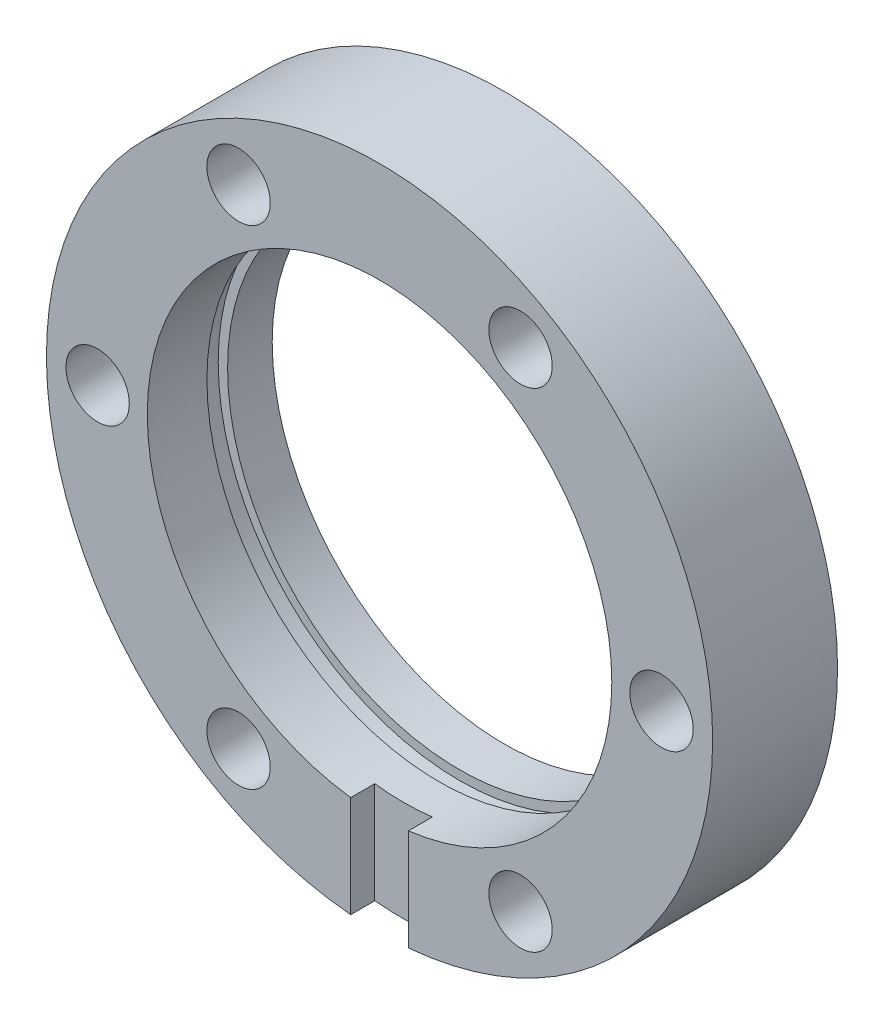
ISO-10303-21;
HEADER;
FILE_DESCRIPTION(('STEP AP214'),'2;1');
FILE_NAME('part.step','',(''),(''),'','','');
FILE_SCHEMA(('AUTOMOTIVE_DESIGN { 1 0 10303 214 1 1 1 1 }'));
ENDSEC;
DATA;
#1=APPLICATION_CONTEXT('core data for automotive mechanical design processes');
#2=APPLICATION_PROTOCOL_DEFINITION('international standard','automotive_design',2000,#1);
#3=PRODUCT_CONTEXT('',#1,'mechanical');
#4=PRODUCT('Part','Part','',(#3));
#5=PRODUCT_RELATED_PRODUCT_CATEGORY('part','',(#4));
#6=PRODUCT_DEFINITION_FORMATION('','',#4);
#7=PRODUCT_DEFINITION_CONTEXT('part definition',#1,'design');
#8=PRODUCT_DEFINITION('design','',#6,#7);
#9=PRODUCT_DEFINITION_SHAPE('','',#8);
#10=(LENGTH_UNIT() NAMED_UNIT(*) SI_UNIT(.MILLI.,.METRE.));
#11=(NAMED_UNIT(*) PLANE_ANGLE_UNIT() SI_UNIT($,.RADIAN.));
#12=(NAMED_UNIT(*) SI_UNIT($,.STERADIAN.) SOLID_ANGLE_UNIT());
#13=UNCERTAINTY_MEASURE_WITH_UNIT(LENGTH_MEASURE(1.E-05),#10,'distance_accuracy_value','');
#14=(GEOMETRIC_REPRESENTATION_CONTEXT(3) GLOBAL_UNCERTAINTY_ASSIGNED_CONTEXT((#13)) GLOBAL_UNIT_ASSIGNED_CONTEXT((#10,
#11,#12)) REPRESENTATION_CONTEXT('',''));
#15=CARTESIAN_POINT('',(0.,0.,0.));
#16=DIRECTION('',(0.,0.,1.));
#17=DIRECTION('',(1.,0.,0.));
#18=AXIS2_PLACEMENT_3D('',#15,#16,#17);
#19=CARTESIAN_POINT('',(14.675,-25.4178456010733,-13.));
#20=DIRECTION('',(0.,0.,-1.));
#21=DIRECTION('',(-0.5,0.866025403784439,0.));
#22=AXIS2_PLACEMENT_3D('',#19,#20,#21);
#23=CYLINDRICAL_SURFACE('',#22,3.3);
#24=CARTESIAN_POINT('',(14.675,-25.4178456010733,-13.));
#25=DIRECTION('',(0.,0.,-1.));
#26=DIRECTION('',(-0.5,0.866025403784439,0.));
#27=AXIS2_PLACEMENT_3D('',#24,#25,#26);
#28=CIRCLE('',#27,3.3);
#29=CARTESIAN_POINT('',(13.025,-22.5599617685846,-13.));
#30=VERTEX_POINT('',#29);
#31=EDGE_CURVE('E156',#30,#30,#28,.T.);
#32=ORIENTED_EDGE('',*,*,#31,.T.);
#33=EDGE_LOOP('',(#32));
#34=FACE_BOUND('',#33,.T.);
#35=CARTESIAN_POINT('',(14.675,-25.4178456010733,0.));
#36=DIRECTION('',(0.,0.,-1.));
#37=DIRECTION('',(-0.5,0.866025403784439,0.));
#38=AXIS2_PLACEMENT_3D('',#35,#36,#37);
#39=CIRCLE('',#38,3.3);
#40=CARTESIAN_POINT('',(13.025,-22.5599617685846,0.));
#41=VERTEX_POINT('',#40);
#42=EDGE_CURVE('E194',#41,#41,#39,.T.);
#43=ORIENTED_EDGE('',*,*,#42,.F.);
#44=EDGE_LOOP('',(#43));
#45=FACE_BOUND('',#44,.T.);
#46=ADVANCED_FACE('F16',(#34,#45),#23,.F.);
#47=CARTESIAN_POINT('',(-14.675,-25.4178456010733,-13.));
#48=DIRECTION('',(0.,0.,-1.));
#49=DIRECTION('',(0.5,0.866025403784439,0.));
#50=AXIS2_PLACEMENT_3D('',#47,#48,#49);
#51=CYLINDRICAL_SURFACE('',#50,3.3);
#52=CARTESIAN_POINT('',(-14.675,-25.4178456010733,-13.));
#53=DIRECTION('',(0.,0.,-1.));
#54=DIRECTION('',(0.5,0.866025403784438,0.));
#55=AXIS2_PLACEMENT_3D('',#52,#53,#54);
#56=CIRCLE('',#55,3.3);
#57=CARTESIAN_POINT('',(-13.025,-22.5599617685846,-13.));
#58=VERTEX_POINT('',#57);
#59=EDGE_CURVE('E160',#58,#58,#56,.T.);
#60=ORIENTED_EDGE('',*,*,#59,.T.);
#61=EDGE_LOOP('',(#60));
#62=FACE_BOUND('',#61,.T.);
#63=CARTESIAN_POINT('',(-14.675,-25.4178456010733,0.));
#64=DIRECTION('',(0.,0.,-1.));
#65=DIRECTION('',(0.5,0.866025403784439,0.));
#66=AXIS2_PLACEMENT_3D('',#63,#64,#65);
#67=CIRCLE('',#66,3.3);
#68=CARTESIAN_POINT('',(-13.025,-22.5599617685846,0.));
#69=VERTEX_POINT('',#68);
#70=EDGE_CURVE('E200',#69,#69,#67,.T.);
#71=ORIENTED_EDGE('',*,*,#70,.F.);
#72=EDGE_LOOP('',(#71));
#73=FACE_BOUND('',#72,.T.);
#74=ADVANCED_FACE('F190',(#62,#73),#51,.F.);
#75=CARTESIAN_POINT('',(-29.35,0.,-13.));
#76=DIRECTION('',(0.,0.,-1.));
#77=DIRECTION('',(1.,0.,0.));
#78=AXIS2_PLACEMENT_3D('',#75,#76,#77);
#79=CYLINDRICAL_SURFACE('',#78,3.3);
#80=CARTESIAN_POINT('',(-29.35,0.,-13.));
#81=DIRECTION('',(0.,0.,-1.));
#82=DIRECTION('',(1.,0.,0.));
#83=AXIS2_PLACEMENT_3D('',#80,#81,#82);
#84=CIRCLE('',#83,3.3);
#85=CARTESIAN_POINT('',(-26.05,0.,-13.));
#86=VERTEX_POINT('',#85);
#87=EDGE_CURVE('E163',#86,#86,#84,.T.);
#88=ORIENTED_EDGE('',*,*,#87,.T.);
#89=EDGE_LOOP('',(#88));
#90=FACE_BOUND('',#89,.T.);
#91=CARTESIAN_POINT('',(-29.35,0.,0.));
#92=DIRECTION('',(0.,0.,-1.));
#93=DIRECTION('',(1.,0.,0.));
#94=AXIS2_PLACEMENT_3D('',#91,#92,#93);
#95=CIRCLE('',#94,3.3);
#96=CARTESIAN_POINT('',(-26.05,0.,0.));
#97=VERTEX_POINT('',#96);
#98=EDGE_CURVE('E207',#97,#97,#95,.T.);
#99=ORIENTED_EDGE('',*,*,#98,.F.);
#100=EDGE_LOOP('',(#99));
#101=FACE_BOUND('',#100,.T.);
#102=ADVANCED_FACE('F311',(#90,#101),#79,.F.);
#103=CARTESIAN_POINT('',(-14.675,25.4178456010733,-13.));
#104=DIRECTION('',(0.,0.,-1.));
#105=DIRECTION('',(0.5,-0.866025403784439,0.));
#106=AXIS2_PLACEMENT_3D('',#103,#104,#105);
#107=CYLINDRICAL_SURFACE('',#106,3.3);
#108=CARTESIAN_POINT('',(-14.675,25.4178456010733,-13.));
#109=DIRECTION('',(0.,0.,-1.));
#110=DIRECTION('',(0.5,-0.866025403784439,0.));
#111=AXIS2_PLACEMENT_3D('',#108,#109,#110);
#112=CIRCLE('',#111,3.3);
#113=CARTESIAN_POINT('',(-13.025,22.5599617685846,-13.));
#114=VERTEX_POINT('',#113);
#115=EDGE_CURVE('E166',#114,#114,#112,.T.);
#116=ORIENTED_EDGE('',*,*,#115,.T.);
#117=EDGE_LOOP('',(#116));
#118=FACE_BOUND('',#117,.T.);
#119=CARTESIAN_POINT('',(-14.675,25.4178456010733,0.));
#120=DIRECTION('',(0.,0.,-1.));
#121=DIRECTION('',(0.5,-0.866025403784439,0.));
#122=AXIS2_PLACEMENT_3D('',#119,#120,#121);
#123=CIRCLE('',#122,3.3);
#124=CARTESIAN_POINT('',(-13.025,22.5599617685846,0.));
#125=VERTEX_POINT('',#124);
#126=EDGE_CURVE('E220',#125,#125,#123,.T.);
#127=ORIENTED_EDGE('',*,*,#126,.F.);
#128=EDGE_LOOP('',(#127));
#129=FACE_BOUND('',#128,.T.);
#130=ADVANCED_FACE('F296',(#118,#129),#107,.F.);
#131=CARTESIAN_POINT('',(14.675,25.4178456010733,-13.));
#132=DIRECTION('',(0.,0.,-1.));
#133=DIRECTION('',(-0.5,-0.866025403784439,0.));
#134=AXIS2_PLACEMENT_3D('',#131,#132,#133);
#135=CYLINDRICAL_SURFACE('',#134,3.3);
#136=CARTESIAN_POINT('',(14.675,25.4178456010733,-13.));
#137=DIRECTION('',(0.,0.,-1.));
#138=DIRECTION('',(-0.5,-0.866025403784439,0.));
#139=AXIS2_PLACEMENT_3D('',#136,#137,#138);
#140=CIRCLE('',#139,3.3);
#141=CARTESIAN_POINT('',(13.025,22.5599617685846,-13.));
#142=VERTEX_POINT('',#141);
#143=EDGE_CURVE('E103',#142,#142,#140,.T.);
#144=ORIENTED_EDGE('',*,*,#143,.T.);
#145=EDGE_LOOP('',(#144));
#146=FACE_BOUND('',#145,.T.);
#147=CARTESIAN_POINT('',(14.675,25.4178456010733,0.));
#148=DIRECTION('',(0.,0.,-1.));
#149=DIRECTION('',(-0.5,-0.866025403784439,0.));
#150=AXIS2_PLACEMENT_3D('',#147,#148,#149);
#151=CIRCLE('',#150,3.3);
#152=CARTESIAN_POINT('',(13.025,22.5599617685846,0.));
#153=VERTEX_POINT('',#152);
#154=EDGE_CURVE('E211',#153,#153,#151,.T.);
#155=ORIENTED_EDGE('',*,*,#154,.F.);
#156=EDGE_LOOP('',(#155));
#157=FACE_BOUND('',#156,.T.);
#158=ADVANCED_FACE('F172',(#146,#157),#135,.F.);
#159=CARTESIAN_POINT('',(-3.,-38.1425,0.));
#160=DIRECTION('',(1.,0.,0.));
#161=DIRECTION('',(0.,1.,0.));
#162=AXIS2_PLACEMENT_3D('',#159,#160,#161);
#163=PLANE('',#162);
#164=DIRECTION('',(0.,1.,0.));
#165=VECTOR('',#164,1.);
#166=CARTESIAN_POINT('',(-3.,-38.1425,0.));
#167=LINE('',#166,#165);
#168=CARTESIAN_POINT('',(-3.,-34.5449797365695,0.));
#169=VERTEX_POINT('',#168);
#170=CARTESIAN_POINT('',(-3.,-23.9881350879971,0.));
#171=VERTEX_POINT('',#170);
#172=EDGE_CURVE('E212',#169,#171,#167,.T.);
#173=ORIENTED_EDGE('',*,*,#172,.F.);
#174=DIRECTION('',(0.,0.,-1.));
#175=VECTOR('',#174,1.);
#176=CARTESIAN_POINT('',(-3.,-34.5449797365695,0.));
#177=LINE('',#176,#175);
#178=CARTESIAN_POINT('',(-3.,-34.5449797365695,-2.5));
#179=VERTEX_POINT('',#178);
#180=EDGE_CURVE('E150',#169,#179,#177,.T.);
#181=ORIENTED_EDGE('',*,*,#180,.T.);
#182=DIRECTION('',(0.,1.,0.));
#183=VECTOR('',#182,1.);
#184=CARTESIAN_POINT('',(-3.,-38.1425,-2.5));
#185=LINE('',#184,#183);
#186=CARTESIAN_POINT('',(-3.,-23.9881350879971,-2.5));
#187=VERTEX_POINT('',#186);
#188=EDGE_CURVE('E11',#179,#187,#185,.T.);
#189=ORIENTED_EDGE('',*,*,#188,.T.);
#190=DIRECTION('',(0.,0.,-1.));
#191=VECTOR('',#190,1.);
#192=CARTESIAN_POINT('',(-3.,-23.9881350879971,0.));
#193=LINE('',#192,#191);
#194=EDGE_CURVE('E137',#171,#187,#193,.T.);
#195=ORIENTED_EDGE('',*,*,#194,.F.);
#196=EDGE_LOOP('',(#173,#181,#189,#195));
#197=FACE_BOUND('',#196,.T.);
#198=ADVANCED_FACE('F248',(#197),#163,.T.);
#199=CARTESIAN_POINT('',(-3.,-38.1425,-2.5));
#200=DIRECTION('',(0.,0.,1.));
#201=DIRECTION('',(1.,0.,0.));
#202=AXIS2_PLACEMENT_3D('',#199,#200,#201);
#203=PLANE('',#202);
#204=ORIENTED_EDGE('',*,*,#188,.F.);
#205=CARTESIAN_POINT('',(0.,0.,-2.5));
#206=DIRECTION('',(0.,0.,1.));
#207=DIRECTION('',(1.,0.,0.));
#208=AXIS2_PLACEMENT_3D('',#205,#206,#207);
#209=CIRCLE('',#208,34.675);
#210=CARTESIAN_POINT('',(3.,-34.5449797365695,-2.5));
#211=VERTEX_POINT('',#210);
#212=EDGE_CURVE('E122',#179,#211,#209,.T.);
#213=ORIENTED_EDGE('',*,*,#212,.T.);
#214=DIRECTION('',(0.,1.,0.));
#215=VECTOR('',#214,1.);
#216=CARTESIAN_POINT('',(3.,-38.1425,-2.5));
#217=LINE('',#216,#215);
#218=CARTESIAN_POINT('',(3.,-23.9881350879971,-2.5));
#219=VERTEX_POINT('',#218);
#220=EDGE_CURVE('E19',#211,#219,#217,.T.);
#221=ORIENTED_EDGE('',*,*,#220,.T.);
#222=CARTESIAN_POINT('',(0.,0.,-2.5));
#223=DIRECTION('',(0.,0.,1.));
#224=DIRECTION('',(1.,0.,0.));
#225=AXIS2_PLACEMENT_3D('',#222,#223,#224);
#226=CIRCLE('',#225,24.175);
#227=EDGE_CURVE('E120',#187,#219,#226,.T.);
#228=ORIENTED_EDGE('',*,*,#227,.F.);
#229=EDGE_LOOP('',(#204,#213,#221,#228));
#230=FACE_BOUND('',#229,.T.);
#231=ADVANCED_FACE('F118',(#230),#203,.T.);
#232=CARTESIAN_POINT('',(3.,-38.1425,-2.5));
#233=DIRECTION('',(-1.,0.,0.));
#234=DIRECTION('',(0.,0.,1.));
#235=AXIS2_PLACEMENT_3D('',#232,#233,#234);
#236=PLANE('',#235);
#237=ORIENTED_EDGE('',*,*,#220,.F.);
#238=DIRECTION('',(0.,0.,1.));
#239=VECTOR('',#238,1.);
#240=CARTESIAN_POINT('',(3.,-34.5449797365695,0.));
#241=LINE('',#240,#239);
#242=CARTESIAN_POINT('',(3.,-34.5449797365695,0.));
#243=VERTEX_POINT('',#242);
#244=EDGE_CURVE('E239',#211,#243,#241,.T.);
#245=ORIENTED_EDGE('',*,*,#244,.T.);
#246=DIRECTION('',(0.,1.,0.));
#247=VECTOR('',#246,1.);
#248=CARTESIAN_POINT('',(3.,-38.1425,0.));
#249=LINE('',#248,#247);
#250=CARTESIAN_POINT('',(3.,-23.9881350879971,0.));
#251=VERTEX_POINT('',#250);
#252=EDGE_CURVE('E132',#243,#251,#249,.T.);
#253=ORIENTED_EDGE('',*,*,#252,.T.);
#254=DIRECTION('',(0.,0.,1.));
#255=VECTOR('',#254,1.);
#256=CARTESIAN_POINT('',(3.,-23.9881350879971,0.));
#257=LINE('',#256,#255);
#258=EDGE_CURVE('E128',#219,#251,#257,.T.);
#259=ORIENTED_EDGE('',*,*,#258,.F.);
#260=EDGE_LOOP('',(#237,#245,#253,#259));
#261=FACE_BOUND('',#260,.T.);
#262=ADVANCED_FACE('F129',(#261),#236,.T.);
#263=CARTESIAN_POINT('',(29.35,0.,-13.));
#264=DIRECTION('',(0.,0.,-1.));
#265=DIRECTION('',(-1.,0.,0.));
#266=AXIS2_PLACEMENT_3D('',#263,#264,#265);
#267=CYLINDRICAL_SURFACE('',#266,3.3);
#268=CARTESIAN_POINT('',(29.35,0.,-13.));
#269=DIRECTION('',(0.,0.,-1.));
#270=DIRECTION('',(-1.,0.,0.));
#271=AXIS2_PLACEMENT_3D('',#268,#269,#270);
#272=CIRCLE('',#271,3.3);
#273=CARTESIAN_POINT('',(26.05,0.,-13.));
#274=VERTEX_POINT('',#273);
#275=EDGE_CURVE('E97',#274,#274,#272,.T.);
#276=ORIENTED_EDGE('',*,*,#275,.T.);
#277=EDGE_LOOP('',(#276));
#278=FACE_BOUND('',#277,.T.);
#279=CARTESIAN_POINT('',(29.35,0.,0.));
#280=DIRECTION('',(0.,0.,-1.));
#281=DIRECTION('',(-1.,0.,0.));
#282=AXIS2_PLACEMENT_3D('',#279,#280,#281);
#283=CIRCLE('',#282,3.3);
#284=CARTESIAN_POINT('',(26.05,0.,0.));
#285=VERTEX_POINT('',#284);
#286=EDGE_CURVE('E227',#285,#285,#283,.T.);
#287=ORIENTED_EDGE('',*,*,#286,.F.);
#288=EDGE_LOOP('',(#287));
#289=FACE_BOUND('',#288,.T.);
#290=ADVANCED_FACE('F302',(#278,#289),#267,.F.);
#291=CARTESIAN_POINT('',(25.15,0.,-6.205));
#292=DIRECTION('',(0.,0.,-1.));
#293=DIRECTION('',(0.,-1.,0.));
#294=AXIS2_PLACEMENT_3D('',#291,#292,#293);
#295=PLANE('',#294);
#296=CARTESIAN_POINT('',(0.,0.,-6.205));
#297=DIRECTION('',(0.,0.,1.));
#298=DIRECTION('',(1.,0.,0.));
#299=AXIS2_PLACEMENT_3D('',#296,#297,#298);
#300=CIRCLE('',#299,25.15);
#301=CARTESIAN_POINT('',(25.15,0.,-6.205));
#302=VERTEX_POINT('',#301);
#303=EDGE_CURVE('E35',#302,#302,#300,.T.);
#304=ORIENTED_EDGE('',*,*,#303,.F.);
#305=EDGE_LOOP('',(#304));
#306=FACE_BOUND('',#305,.T.);
#307=CARTESIAN_POINT('',(0.,0.,-6.205));
#308=DIRECTION('',(0.,0.,1.));
#309=DIRECTION('',(1.,0.,0.));
#310=AXIS2_PLACEMENT_3D('',#307,#308,#309);
#311=CIRCLE('',#310,24.175);
#312=CARTESIAN_POINT('',(24.175,0.,-6.205));
#313=VERTEX_POINT('',#312);
#314=EDGE_CURVE('E144',#313,#313,#311,.T.);
#315=ORIENTED_EDGE('',*,*,#314,.T.);
#316=EDGE_LOOP('',(#315));
#317=FACE_BOUND('',#316,.T.);
#318=ADVANCED_FACE('F291',(#306,#317),#295,.T.);
#319=CARTESIAN_POINT('',(0.,0.,0.));
#320=DIRECTION('',(0.,0.,1.));
#321=DIRECTION('',(1.,0.,0.));
#322=AXIS2_PLACEMENT_3D('',#319,#320,#321);
#323=CYLINDRICAL_SURFACE('',#322,25.15);
#324=CARTESIAN_POINT('',(0.,0.,-8.355));
#325=DIRECTION('',(0.,0.,1.));
#326=DIRECTION('',(1.,0.,0.));
#327=AXIS2_PLACEMENT_3D('',#324,#325,#326);
#328=CIRCLE('',#327,25.15);
#329=CARTESIAN_POINT('',(25.15,0.,-8.355));
#330=VERTEX_POINT('',#329);
#331=EDGE_CURVE('E45',#330,#330,#328,.T.);
#332=ORIENTED_EDGE('',*,*,#331,.F.);
#333=EDGE_LOOP('',(#332));
#334=FACE_BOUND('',#333,.T.);
#335=ORIENTED_EDGE('',*,*,#303,.T.);
#336=EDGE_LOOP('',(#335));
#337=FACE_BOUND('',#336,.T.);
#338=ADVANCED_FACE('F288',(#334,#337),#323,.F.);
#339=CARTESIAN_POINT('',(24.175,0.,-8.355));
#340=DIRECTION('',(0.,0.,1.));
#341=DIRECTION('',(1.,0.,0.));
#342=AXIS2_PLACEMENT_3D('',#339,#340,#341);
#343=PLANE('',#342);
#344=CARTESIAN_POINT('',(0.,0.,-8.355));
#345=DIRECTION('',(0.,0.,1.));
#346=DIRECTION('',(1.,0.,0.));
#347=AXIS2_PLACEMENT_3D('',#344,#345,#346);
#348=CIRCLE('',#347,24.175);
#349=CARTESIAN_POINT('',(24.175,0.,-8.355));
#350=VERTEX_POINT('',#349);
#351=EDGE_CURVE('E96',#350,#350,#348,.T.);
#352=ORIENTED_EDGE('',*,*,#351,.F.);
#353=EDGE_LOOP('',(#352));
#354=FACE_BOUND('',#353,.T.);
#355=ORIENTED_EDGE('',*,*,#331,.T.);
#356=EDGE_LOOP('',(#355));
#357=FACE_BOUND('',#356,.T.);
#358=ADVANCED_FACE('F290',(#354,#357),#343,.T.);
#359=CARTESIAN_POINT('',(0.,0.,0.));
#360=DIRECTION('',(0.,0.,1.));
#361=DIRECTION('',(1.,0.,0.));
#362=AXIS2_PLACEMENT_3D('',#359,#360,#361);
#363=CYLINDRICAL_SURFACE('',#362,24.175);
#364=CARTESIAN_POINT('',(0.,0.,-13.));
#365=DIRECTION('',(0.,0.,1.));
#366=DIRECTION('',(1.,0.,0.));
#367=AXIS2_PLACEMENT_3D('',#364,#365,#366);
#368=CIRCLE('',#367,24.175);
#369=CARTESIAN_POINT('',(24.175,0.,-13.));
#370=VERTEX_POINT('',#369);
#371=EDGE_CURVE('E91',#370,#370,#368,.T.);
#372=ORIENTED_EDGE('',*,*,#371,.F.);
#373=EDGE_LOOP('',(#372));
#374=FACE_BOUND('',#373,.T.);
#375=ORIENTED_EDGE('',*,*,#351,.T.);
#376=EDGE_LOOP('',(#375));
#377=FACE_BOUND('',#376,.T.);
#378=ADVANCED_FACE('F177',(#374,#377),#363,.F.);
#379=CARTESIAN_POINT('',(34.675,0.,-13.));
#380=DIRECTION('',(0.,0.,-1.));
#381=DIRECTION('',(0.,-1.,0.));
#382=AXIS2_PLACEMENT_3D('',#379,#380,#381);
#383=PLANE('',#382);
#384=CARTESIAN_POINT('',(0.,0.,-13.));
#385=DIRECTION('',(0.,0.,1.));
#386=DIRECTION('',(1.,0.,0.));
#387=AXIS2_PLACEMENT_3D('',#384,#385,#386);
#388=CIRCLE('',#387,34.675);
#389=CARTESIAN_POINT('',(34.675,0.,-13.));
#390=VERTEX_POINT('',#389);
#391=EDGE_CURVE('E233',#390,#390,#388,.T.);
#392=ORIENTED_EDGE('',*,*,#391,.F.);
#393=EDGE_LOOP('',(#392));
#394=FACE_BOUND('',#393,.T.);
#395=ORIENTED_EDGE('',*,*,#371,.T.);
#396=EDGE_LOOP('',(#395));
#397=FACE_BOUND('',#396,.T.);
#398=ORIENTED_EDGE('',*,*,#275,.F.);
#399=EDGE_LOOP('',(#398));
#400=FACE_BOUND('',#399,.T.);
#401=ORIENTED_EDGE('',*,*,#143,.F.);
#402=EDGE_LOOP('',(#401));
#403=FACE_BOUND('',#402,.T.);
#404=ORIENTED_EDGE('',*,*,#115,.F.);
#405=EDGE_LOOP('',(#404));
#406=FACE_BOUND('',#405,.T.);
#407=ORIENTED_EDGE('',*,*,#87,.F.);
#408=EDGE_LOOP('',(#407));
#409=FACE_BOUND('',#408,.T.);
#410=ORIENTED_EDGE('',*,*,#59,.F.);
#411=EDGE_LOOP('',(#410));
#412=FACE_BOUND('',#411,.T.);
#413=ORIENTED_EDGE('',*,*,#31,.F.);
#414=EDGE_LOOP('',(#413));
#415=FACE_BOUND('',#414,.T.);
#416=ADVANCED_FACE('F92',(#394,#397,#400,#403,#406,#409,#412,#415),#383,.T.);
#417=CARTESIAN_POINT('',(0.,0.,0.));
#418=DIRECTION('',(0.,0.,1.));
#419=DIRECTION('',(1.,0.,0.));
#420=AXIS2_PLACEMENT_3D('',#417,#418,#419);
#421=CYLINDRICAL_SURFACE('',#420,24.175);
#422=ORIENTED_EDGE('',*,*,#227,.T.);
#423=ORIENTED_EDGE('',*,*,#258,.T.);
#424=CARTESIAN_POINT('',(0.,0.,0.));
#425=DIRECTION('',(0.,0.,1.));
#426=DIRECTION('',(1.,0.,0.));
#427=AXIS2_PLACEMENT_3D('',#424,#425,#426);
#428=CIRCLE('',#427,24.175);
#429=EDGE_CURVE('E214',#251,#171,#428,.T.);
#430=ORIENTED_EDGE('',*,*,#429,.T.);
#431=ORIENTED_EDGE('',*,*,#194,.T.);
#432=EDGE_LOOP('',(#422,#423,#430,#431));
#433=FACE_BOUND('',#432,.T.);
#434=ORIENTED_EDGE('',*,*,#314,.F.);
#435=EDGE_LOOP('',(#434));
#436=FACE_BOUND('',#435,.T.);
#437=ADVANCED_FACE('F140',(#433,#436),#421,.F.);
#438=CARTESIAN_POINT('',(0.,0.,0.));
#439=DIRECTION('',(0.,0.,1.));
#440=DIRECTION('',(1.,0.,0.));
#441=AXIS2_PLACEMENT_3D('',#438,#439,#440);
#442=CYLINDRICAL_SURFACE('',#441,34.675);
#443=CARTESIAN_POINT('',(0.,0.,0.));
#444=DIRECTION('',(0.,0.,1.));
#445=DIRECTION('',(1.,0.,0.));
#446=AXIS2_PLACEMENT_3D('',#443,#444,#445);
#447=CIRCLE('',#446,34.675);
#448=EDGE_CURVE('E215',#243,#169,#447,.T.);
#449=ORIENTED_EDGE('',*,*,#448,.F.);
#450=ORIENTED_EDGE('',*,*,#244,.F.);
#451=ORIENTED_EDGE('',*,*,#212,.F.);
#452=ORIENTED_EDGE('',*,*,#180,.F.);
#453=EDGE_LOOP('',(#449,#450,#451,#452));
#454=FACE_BOUND('',#453,.T.);
#455=ORIENTED_EDGE('',*,*,#391,.T.);
#456=EDGE_LOOP('',(#455));
#457=FACE_BOUND('',#456,.T.);
#458=ADVANCED_FACE('F254',(#454,#457),#442,.T.);
#459=CARTESIAN_POINT('',(24.175,0.,0.));
#460=DIRECTION('',(0.,0.,1.));
#461=DIRECTION('',(1.,0.,0.));
#462=AXIS2_PLACEMENT_3D('',#459,#460,#461);
#463=PLANE('',#462);
#464=ORIENTED_EDGE('',*,*,#448,.T.);
#465=ORIENTED_EDGE('',*,*,#172,.T.);
#466=ORIENTED_EDGE('',*,*,#429,.F.);
#467=ORIENTED_EDGE('',*,*,#252,.F.);
#468=EDGE_LOOP('',(#464,#465,#466,#467));
#469=FACE_BOUND('',#468,.T.);
#470=ORIENTED_EDGE('',*,*,#286,.T.);
#471=EDGE_LOOP('',(#470));
#472=FACE_BOUND('',#471,.T.);
#473=ORIENTED_EDGE('',*,*,#154,.T.);
#474=EDGE_LOOP('',(#473));
#475=FACE_BOUND('',#474,.T.);
#476=ORIENTED_EDGE('',*,*,#126,.T.);
#477=EDGE_LOOP('',(#476));
#478=FACE_BOUND('',#477,.T.);
#479=ORIENTED_EDGE('',*,*,#98,.T.);
#480=EDGE_LOOP('',(#479));
#481=FACE_BOUND('',#480,.T.);
#482=ORIENTED_EDGE('',*,*,#70,.T.);
#483=EDGE_LOOP('',(#482));
#484=FACE_BOUND('',#483,.T.);
#485=ORIENTED_EDGE('',*,*,#42,.T.);
#486=EDGE_LOOP('',(#485));
#487=FACE_BOUND('',#486,.T.);
#488=ADVANCED_FACE('F261',(#469,#472,#475,#478,#481,#484,#487),#463,.T.);
#489=CLOSED_SHELL('',(#46,#74,#102,#130,#158,#198,#231,#262,#290,#318,#338,#358,#378,#416,#437,
#458,#488));
#490=MANIFOLD_SOLID_BREP('B1',#489);
#491=ADVANCED_BREP_SHAPE_REPRESENTATION('',(#18,#490),#14);
#492=SHAPE_DEFINITION_REPRESENTATION(#9,#491);
ENDSEC;
END-ISO-10303-21;
